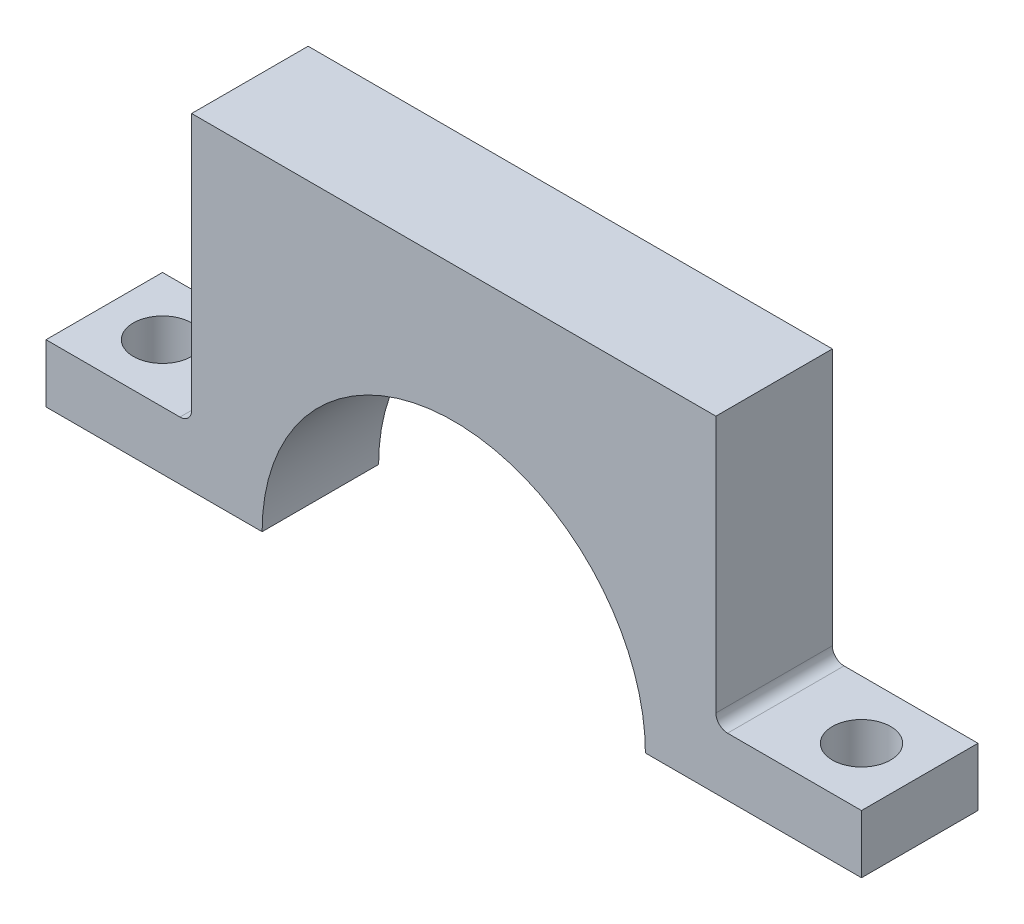
ISO-10303-21;
HEADER;
FILE_DESCRIPTION(('STEP AP214'),'2;1');
FILE_NAME('part.step','',(''),(''),'','','');
FILE_SCHEMA(('AUTOMOTIVE_DESIGN { 1 0 10303 214 1 1 1 1 }'));
ENDSEC;
DATA;
#1=APPLICATION_CONTEXT('core data for automotive mechanical design processes');
#2=APPLICATION_PROTOCOL_DEFINITION('international standard','automotive_design',2000,#1);
#3=PRODUCT_CONTEXT('',#1,'mechanical');
#4=PRODUCT('Part','Part','',(#3));
#5=PRODUCT_RELATED_PRODUCT_CATEGORY('part','',(#4));
#6=PRODUCT_DEFINITION_FORMATION('','',#4);
#7=PRODUCT_DEFINITION_CONTEXT('part definition',#1,'design');
#8=PRODUCT_DEFINITION('design','',#6,#7);
#9=PRODUCT_DEFINITION_SHAPE('','',#8);
#10=(LENGTH_UNIT() NAMED_UNIT(*) SI_UNIT(.MILLI.,.METRE.));
#11=(NAMED_UNIT(*) PLANE_ANGLE_UNIT() SI_UNIT($,.RADIAN.));
#12=(NAMED_UNIT(*) SI_UNIT($,.STERADIAN.) SOLID_ANGLE_UNIT());
#13=UNCERTAINTY_MEASURE_WITH_UNIT(LENGTH_MEASURE(1.E-05),#10,'distance_accuracy_value','');
#14=(GEOMETRIC_REPRESENTATION_CONTEXT(3) GLOBAL_UNCERTAINTY_ASSIGNED_CONTEXT((#13)) GLOBAL_UNIT_ASSIGNED_CONTEXT((#10,
#11,#12)) REPRESENTATION_CONTEXT('',''));
#15=CARTESIAN_POINT('',(0.,0.,0.));
#16=DIRECTION('',(0.,0.,1.));
#17=DIRECTION('',(1.,0.,0.));
#18=AXIS2_PLACEMENT_3D('',#15,#16,#17);
#19=CARTESIAN_POINT('',(0.,0.,5.));
#20=DIRECTION('',(0.,0.,-1.));
#21=DIRECTION('',(-1.,0.,0.));
#22=AXIS2_PLACEMENT_3D('',#19,#20,#21);
#23=CYLINDRICAL_SURFACE('',#22,16.45);
#24=CARTESIAN_POINT('',(0.,0.,-5.));
#25=DIRECTION('',(0.,0.,-1.));
#26=DIRECTION('',(1.,0.,0.));
#27=AXIS2_PLACEMENT_3D('',#24,#25,#26);
#28=CIRCLE('',#27,16.45);
#29=CARTESIAN_POINT('',(-16.45,0.,-5.));
#30=VERTEX_POINT('',#29);
#31=CARTESIAN_POINT('',(16.45,0.,-5.));
#32=VERTEX_POINT('',#31);
#33=EDGE_CURVE('E191',#30,#32,#28,.T.);
#34=ORIENTED_EDGE('',*,*,#33,.T.);
#35=DIRECTION('',(0.,0.,-1.));
#36=VECTOR('',#35,1.);
#37=CARTESIAN_POINT('',(16.45,0.,5.));
#38=LINE('',#37,#36);
#39=CARTESIAN_POINT('',(16.45,0.,5.));
#40=VERTEX_POINT('',#39);
#41=EDGE_CURVE('E244',#40,#32,#38,.T.);
#42=ORIENTED_EDGE('',*,*,#41,.F.);
#43=CARTESIAN_POINT('',(0.,0.,5.));
#44=DIRECTION('',(0.,0.,-1.));
#45=DIRECTION('',(1.,0.,0.));
#46=AXIS2_PLACEMENT_3D('',#43,#44,#45);
#47=CIRCLE('',#46,16.45);
#48=CARTESIAN_POINT('',(-16.45,0.,5.));
#49=VERTEX_POINT('',#48);
#50=EDGE_CURVE('E195',#49,#40,#47,.T.);
#51=ORIENTED_EDGE('',*,*,#50,.F.);
#52=DIRECTION('',(0.,0.,-1.));
#53=VECTOR('',#52,1.);
#54=CARTESIAN_POINT('',(-16.45,0.,5.));
#55=LINE('',#54,#53);
#56=EDGE_CURVE('E214',#49,#30,#55,.T.);
#57=ORIENTED_EDGE('',*,*,#56,.T.);
#58=EDGE_LOOP('',(#34,#42,#51,#57));
#59=FACE_BOUND('',#58,.T.);
#60=ADVANCED_FACE('F39',(#59),#23,.F.);
#61=CARTESIAN_POINT('',(16.45,0.,5.));
#62=DIRECTION('',(0.,1.,0.));
#63=DIRECTION('',(-1.,0.,0.));
#64=AXIS2_PLACEMENT_3D('',#61,#62,#63);
#65=PLANE('',#64);
#66=DIRECTION('',(1.,0.,0.));
#67=VECTOR('',#66,1.);
#68=CARTESIAN_POINT('',(16.45,0.,-5.));
#69=LINE('',#68,#67);
#70=CARTESIAN_POINT('',(35.,0.,-5.));
#71=VERTEX_POINT('',#70);
#72=EDGE_CURVE('E218',#32,#71,#69,.T.);
#73=ORIENTED_EDGE('',*,*,#72,.T.);
#74=DIRECTION('',(0.,0.,1.));
#75=VECTOR('',#74,1.);
#76=CARTESIAN_POINT('',(35.,0.,5.));
#77=LINE('',#76,#75);
#78=CARTESIAN_POINT('',(35.,0.,5.));
#79=VERTEX_POINT('',#78);
#80=EDGE_CURVE('E168',#71,#79,#77,.T.);
#81=ORIENTED_EDGE('',*,*,#80,.T.);
#82=DIRECTION('',(1.,0.,0.));
#83=VECTOR('',#82,1.);
#84=CARTESIAN_POINT('',(16.45,0.,5.));
#85=LINE('',#84,#83);
#86=EDGE_CURVE('E199',#40,#79,#85,.T.);
#87=ORIENTED_EDGE('',*,*,#86,.F.);
#88=ORIENTED_EDGE('',*,*,#41,.T.);
#89=EDGE_LOOP('',(#73,#81,#87,#88));
#90=FACE_BOUND('',#89,.T.);
#91=CARTESIAN_POINT('',(30.,0.,0.));
#92=DIRECTION('',(0.,-1.,0.));
#93=DIRECTION('',(-1.,0.,0.));
#94=AXIS2_PLACEMENT_3D('',#91,#92,#93);
#95=CIRCLE('',#94,2.5);
#96=CARTESIAN_POINT('',(27.5,0.,0.));
#97=VERTEX_POINT('',#96);
#98=EDGE_CURVE('E162',#97,#97,#95,.T.);
#99=ORIENTED_EDGE('',*,*,#98,.F.);
#100=EDGE_LOOP('',(#99));
#101=FACE_BOUND('',#100,.T.);
#102=ADVANCED_FACE('F291',(#90,#101),#65,.F.);
#103=CARTESIAN_POINT('',(22.5,0.,5.));
#104=DIRECTION('',(-1.,0.,0.));
#105=DIRECTION('',(0.,0.,1.));
#106=AXIS2_PLACEMENT_3D('',#103,#104,#105);
#107=PLANE('',#106);
#108=DIRECTION('',(0.,1.,0.));
#109=VECTOR('',#108,1.);
#110=CARTESIAN_POINT('',(22.5,0.,5.));
#111=LINE('',#110,#109);
#112=CARTESIAN_POINT('',(22.5,6.,5.));
#113=VERTEX_POINT('',#112);
#114=CARTESIAN_POINT('',(22.5,28.0667067082245,5.));
#115=VERTEX_POINT('',#114);
#116=EDGE_CURVE('E202',#113,#115,#111,.T.);
#117=ORIENTED_EDGE('',*,*,#116,.F.);
#118=DIRECTION('',(0.,0.,-1.));
#119=VECTOR('',#118,1.);
#120=CARTESIAN_POINT('',(22.5,6.,5.));
#121=LINE('',#120,#119);
#122=CARTESIAN_POINT('',(22.5,6.,-5.));
#123=VERTEX_POINT('',#122);
#124=EDGE_CURVE('E248',#113,#123,#121,.T.);
#125=ORIENTED_EDGE('',*,*,#124,.T.);
#126=DIRECTION('',(0.,1.,0.));
#127=VECTOR('',#126,1.);
#128=CARTESIAN_POINT('',(22.5,0.,-5.));
#129=LINE('',#128,#127);
#130=CARTESIAN_POINT('',(22.5,28.0667067082245,-5.));
#131=VERTEX_POINT('',#130);
#132=EDGE_CURVE('E221',#123,#131,#129,.T.);
#133=ORIENTED_EDGE('',*,*,#132,.T.);
#134=DIRECTION('',(0.,0.,-1.));
#135=VECTOR('',#134,1.);
#136=CARTESIAN_POINT('',(22.5,28.0667067082245,5.));
#137=LINE('',#136,#135);
#138=EDGE_CURVE('E240',#115,#131,#137,.T.);
#139=ORIENTED_EDGE('',*,*,#138,.F.);
#140=EDGE_LOOP('',(#117,#125,#133,#139));
#141=FACE_BOUND('',#140,.T.);
#142=ADVANCED_FACE('F276',(#141),#107,.F.);
#143=CARTESIAN_POINT('',(22.5,28.0667067082245,5.));
#144=DIRECTION('',(0.,-1.,0.));
#145=DIRECTION('',(1.,0.,0.));
#146=AXIS2_PLACEMENT_3D('',#143,#144,#145);
#147=PLANE('',#146);
#148=DIRECTION('',(-1.,0.,0.));
#149=VECTOR('',#148,1.);
#150=CARTESIAN_POINT('',(22.5,28.0667067082245,-5.));
#151=LINE('',#150,#149);
#152=CARTESIAN_POINT('',(-22.5,28.0667067082245,-5.));
#153=VERTEX_POINT('',#152);
#154=EDGE_CURVE('E224',#131,#153,#151,.T.);
#155=ORIENTED_EDGE('',*,*,#154,.T.);
#156=DIRECTION('',(0.,0.,-1.));
#157=VECTOR('',#156,1.);
#158=CARTESIAN_POINT('',(-22.5,28.0667067082245,5.));
#159=LINE('',#158,#157);
#160=CARTESIAN_POINT('',(-22.5,28.0667067082245,5.));
#161=VERTEX_POINT('',#160);
#162=EDGE_CURVE('E236',#161,#153,#159,.T.);
#163=ORIENTED_EDGE('',*,*,#162,.F.);
#164=DIRECTION('',(-1.,0.,0.));
#165=VECTOR('',#164,1.);
#166=CARTESIAN_POINT('',(22.5,28.0667067082245,5.));
#167=LINE('',#166,#165);
#168=EDGE_CURVE('E205',#115,#161,#167,.T.);
#169=ORIENTED_EDGE('',*,*,#168,.F.);
#170=ORIENTED_EDGE('',*,*,#138,.T.);
#171=EDGE_LOOP('',(#155,#163,#169,#170));
#172=FACE_BOUND('',#171,.T.);
#173=ADVANCED_FACE('F307',(#172),#147,.F.);
#174=CARTESIAN_POINT('',(-22.5,0.,5.));
#175=DIRECTION('',(1.,0.,0.));
#176=DIRECTION('',(0.,1.,0.));
#177=AXIS2_PLACEMENT_3D('',#174,#175,#176);
#178=PLANE('',#177);
#179=DIRECTION('',(0.,-1.,0.));
#180=VECTOR('',#179,1.);
#181=CARTESIAN_POINT('',(-22.5,0.,-5.));
#182=LINE('',#181,#180);
#183=CARTESIAN_POINT('',(-22.5,6.,-5.));
#184=VERTEX_POINT('',#183);
#185=EDGE_CURVE('E227',#153,#184,#182,.T.);
#186=ORIENTED_EDGE('',*,*,#185,.T.);
#187=DIRECTION('',(0.,0.,1.));
#188=VECTOR('',#187,1.);
#189=CARTESIAN_POINT('',(-22.5,6.,5.));
#190=LINE('',#189,#188);
#191=CARTESIAN_POINT('',(-22.5,6.,5.));
#192=VERTEX_POINT('',#191);
#193=EDGE_CURVE('E255',#184,#192,#190,.T.);
#194=ORIENTED_EDGE('',*,*,#193,.T.);
#195=DIRECTION('',(0.,-1.,0.));
#196=VECTOR('',#195,1.);
#197=CARTESIAN_POINT('',(-22.5,0.,5.));
#198=LINE('',#197,#196);
#199=EDGE_CURVE('E208',#161,#192,#198,.T.);
#200=ORIENTED_EDGE('',*,*,#199,.F.);
#201=ORIENTED_EDGE('',*,*,#162,.T.);
#202=EDGE_LOOP('',(#186,#194,#200,#201));
#203=FACE_BOUND('',#202,.T.);
#204=ADVANCED_FACE('F303',(#203),#178,.F.);
#205=CARTESIAN_POINT('',(-16.45,0.,5.));
#206=DIRECTION('',(0.,1.,0.));
#207=DIRECTION('',(-1.,0.,0.));
#208=AXIS2_PLACEMENT_3D('',#205,#206,#207);
#209=PLANE('',#208);
#210=DIRECTION('',(1.,0.,0.));
#211=VECTOR('',#210,1.);
#212=CARTESIAN_POINT('',(-16.45,0.,-5.));
#213=LINE('',#212,#211);
#214=CARTESIAN_POINT('',(-35.,0.,-5.));
#215=VERTEX_POINT('',#214);
#216=EDGE_CURVE('E132',#215,#30,#213,.T.);
#217=ORIENTED_EDGE('',*,*,#216,.T.);
#218=ORIENTED_EDGE('',*,*,#56,.F.);
#219=DIRECTION('',(1.,0.,0.));
#220=VECTOR('',#219,1.);
#221=CARTESIAN_POINT('',(-16.45,0.,5.));
#222=LINE('',#221,#220);
#223=CARTESIAN_POINT('',(-35.,0.,5.));
#224=VERTEX_POINT('',#223);
#225=EDGE_CURVE('E211',#224,#49,#222,.T.);
#226=ORIENTED_EDGE('',*,*,#225,.F.);
#227=DIRECTION('',(0.,0.,-1.));
#228=VECTOR('',#227,1.);
#229=CARTESIAN_POINT('',(-35.,0.,5.));
#230=LINE('',#229,#228);
#231=EDGE_CURVE('E150',#224,#215,#230,.T.);
#232=ORIENTED_EDGE('',*,*,#231,.T.);
#233=EDGE_LOOP('',(#217,#218,#226,#232));
#234=FACE_BOUND('',#233,.T.);
#235=CARTESIAN_POINT('',(-30.,0.,0.));
#236=DIRECTION('',(0.,-1.,0.));
#237=DIRECTION('',(1.,0.,0.));
#238=AXIS2_PLACEMENT_3D('',#235,#236,#237);
#239=CIRCLE('',#238,2.5);
#240=CARTESIAN_POINT('',(-27.5,0.,0.));
#241=VERTEX_POINT('',#240);
#242=EDGE_CURVE('E156',#241,#241,#239,.T.);
#243=ORIENTED_EDGE('',*,*,#242,.F.);
#244=EDGE_LOOP('',(#243));
#245=FACE_BOUND('',#244,.T.);
#246=ADVANCED_FACE('F297',(#234,#245),#209,.F.);
#247=CARTESIAN_POINT('',(0.,0.,5.));
#248=DIRECTION('',(0.,0.,1.));
#249=DIRECTION('',(1.,0.,0.));
#250=AXIS2_PLACEMENT_3D('',#247,#248,#249);
#251=PLANE('',#250);
#252=ORIENTED_EDGE('',*,*,#50,.T.);
#253=ORIENTED_EDGE('',*,*,#86,.T.);
#254=DIRECTION('',(0.,-1.,0.));
#255=VECTOR('',#254,1.);
#256=CARTESIAN_POINT('',(35.,5.,5.));
#257=LINE('',#256,#255);
#258=CARTESIAN_POINT('',(35.,5.,5.));
#259=VERTEX_POINT('',#258);
#260=EDGE_CURVE('E187',#259,#79,#257,.T.);
#261=ORIENTED_EDGE('',*,*,#260,.F.);
#262=DIRECTION('',(-1.,0.,0.));
#263=VECTOR('',#262,1.);
#264=CARTESIAN_POINT('',(22.5,5.,5.));
#265=LINE('',#264,#263);
#266=CARTESIAN_POINT('',(23.5,5.,5.));
#267=VERTEX_POINT('',#266);
#268=EDGE_CURVE('E179',#259,#267,#265,.T.);
#269=ORIENTED_EDGE('',*,*,#268,.T.);
#270=CARTESIAN_POINT('',(23.5,6.,5.));
#271=DIRECTION('',(0.,0.,1.));
#272=DIRECTION('',(1.,0.,0.));
#273=AXIS2_PLACEMENT_3D('',#270,#271,#272);
#274=CIRCLE('',#273,1.);
#275=EDGE_CURVE('E264',#267,#113,#274,.F.);
#276=ORIENTED_EDGE('',*,*,#275,.T.);
#277=ORIENTED_EDGE('',*,*,#116,.T.);
#278=ORIENTED_EDGE('',*,*,#168,.T.);
#279=ORIENTED_EDGE('',*,*,#199,.T.);
#280=CARTESIAN_POINT('',(-23.5,6.,5.));
#281=DIRECTION('',(0.,0.,1.));
#282=DIRECTION('',(1.,0.,0.));
#283=AXIS2_PLACEMENT_3D('',#280,#281,#282);
#284=CIRCLE('',#283,1.);
#285=CARTESIAN_POINT('',(-23.5,5.,5.));
#286=VERTEX_POINT('',#285);
#287=EDGE_CURVE('E48',#192,#286,#284,.F.);
#288=ORIENTED_EDGE('',*,*,#287,.T.);
#289=DIRECTION('',(-1.,0.,0.));
#290=VECTOR('',#289,1.);
#291=CARTESIAN_POINT('',(-35.,5.,5.));
#292=LINE('',#291,#290);
#293=CARTESIAN_POINT('',(-35.,5.,5.));
#294=VERTEX_POINT('',#293);
#295=EDGE_CURVE('E139',#286,#294,#292,.T.);
#296=ORIENTED_EDGE('',*,*,#295,.T.);
#297=DIRECTION('',(0.,-1.,0.));
#298=VECTOR('',#297,1.);
#299=CARTESIAN_POINT('',(-35.,5.,5.));
#300=LINE('',#299,#298);
#301=EDGE_CURVE('E138',#294,#224,#300,.T.);
#302=ORIENTED_EDGE('',*,*,#301,.T.);
#303=ORIENTED_EDGE('',*,*,#225,.T.);
#304=EDGE_LOOP('',(#252,#253,#261,#269,#276,#277,#278,#279,#288,#296,#302,#303));
#305=FACE_BOUND('',#304,.T.);
#306=ADVANCED_FACE('F269',(#305),#251,.T.);
#307=CARTESIAN_POINT('',(0.,0.,-5.));
#308=DIRECTION('',(0.,0.,1.));
#309=DIRECTION('',(1.,0.,0.));
#310=AXIS2_PLACEMENT_3D('',#307,#308,#309);
#311=PLANE('',#310);
#312=ORIENTED_EDGE('',*,*,#33,.F.);
#313=ORIENTED_EDGE('',*,*,#216,.F.);
#314=DIRECTION('',(0.,-1.,0.));
#315=VECTOR('',#314,1.);
#316=CARTESIAN_POINT('',(-35.,5.,-5.));
#317=LINE('',#316,#315);
#318=CARTESIAN_POINT('',(-35.,5.,-5.));
#319=VERTEX_POINT('',#318);
#320=EDGE_CURVE('E127',#319,#215,#317,.T.);
#321=ORIENTED_EDGE('',*,*,#320,.F.);
#322=DIRECTION('',(1.,0.,0.));
#323=VECTOR('',#322,1.);
#324=CARTESIAN_POINT('',(-35.,5.,-5.));
#325=LINE('',#324,#323);
#326=CARTESIAN_POINT('',(-23.5,5.,-5.));
#327=VERTEX_POINT('',#326);
#328=EDGE_CURVE('E130',#319,#327,#325,.T.);
#329=ORIENTED_EDGE('',*,*,#328,.T.);
#330=CARTESIAN_POINT('',(-23.5,6.,-5.));
#331=DIRECTION('',(0.,0.,1.));
#332=DIRECTION('',(1.,0.,0.));
#333=AXIS2_PLACEMENT_3D('',#330,#331,#332);
#334=CIRCLE('',#333,1.);
#335=EDGE_CURVE('E11',#327,#184,#334,.T.);
#336=ORIENTED_EDGE('',*,*,#335,.T.);
#337=ORIENTED_EDGE('',*,*,#185,.F.);
#338=ORIENTED_EDGE('',*,*,#154,.F.);
#339=ORIENTED_EDGE('',*,*,#132,.F.);
#340=CARTESIAN_POINT('',(23.5,6.,-5.));
#341=DIRECTION('',(0.,0.,1.));
#342=DIRECTION('',(1.,0.,0.));
#343=AXIS2_PLACEMENT_3D('',#340,#341,#342);
#344=CIRCLE('',#343,1.);
#345=CARTESIAN_POINT('',(23.5,5.,-5.));
#346=VERTEX_POINT('',#345);
#347=EDGE_CURVE('E261',#123,#346,#344,.T.);
#348=ORIENTED_EDGE('',*,*,#347,.T.);
#349=DIRECTION('',(1.,0.,0.));
#350=VECTOR('',#349,1.);
#351=CARTESIAN_POINT('',(22.5,5.,-5.));
#352=LINE('',#351,#350);
#353=CARTESIAN_POINT('',(35.,5.,-5.));
#354=VERTEX_POINT('',#353);
#355=EDGE_CURVE('E172',#346,#354,#352,.T.);
#356=ORIENTED_EDGE('',*,*,#355,.T.);
#357=DIRECTION('',(0.,-1.,0.));
#358=VECTOR('',#357,1.);
#359=CARTESIAN_POINT('',(35.,5.,-5.));
#360=LINE('',#359,#358);
#361=EDGE_CURVE('E183',#354,#71,#360,.T.);
#362=ORIENTED_EDGE('',*,*,#361,.T.);
#363=ORIENTED_EDGE('',*,*,#72,.F.);
#364=EDGE_LOOP('',(#312,#313,#321,#329,#336,#337,#338,#339,#348,#356,#362,#363));
#365=FACE_BOUND('',#364,.T.);
#366=ADVANCED_FACE('F129',(#365),#311,.F.);
#367=CARTESIAN_POINT('',(35.,5.,5.));
#368=DIRECTION('',(1.,0.,0.));
#369=DIRECTION('',(0.,1.,0.));
#370=AXIS2_PLACEMENT_3D('',#367,#368,#369);
#371=PLANE('',#370);
#372=ORIENTED_EDGE('',*,*,#80,.F.);
#373=ORIENTED_EDGE('',*,*,#361,.F.);
#374=DIRECTION('',(0.,0.,1.));
#375=VECTOR('',#374,1.);
#376=CARTESIAN_POINT('',(35.,5.,5.));
#377=LINE('',#376,#375);
#378=EDGE_CURVE('E175',#354,#259,#377,.T.);
#379=ORIENTED_EDGE('',*,*,#378,.T.);
#380=ORIENTED_EDGE('',*,*,#260,.T.);
#381=EDGE_LOOP('',(#372,#373,#379,#380));
#382=FACE_BOUND('',#381,.T.);
#383=ADVANCED_FACE('F288',(#382),#371,.T.);
#384=CARTESIAN_POINT('',(0.,5.,0.));
#385=DIRECTION('',(0.,1.,0.));
#386=DIRECTION('',(-1.,0.,0.));
#387=AXIS2_PLACEMENT_3D('',#384,#385,#386);
#388=PLANE('',#387);
#389=CARTESIAN_POINT('',(30.,5.,0.));
#390=DIRECTION('',(0.,-1.,0.));
#391=DIRECTION('',(-1.,0.,0.));
#392=AXIS2_PLACEMENT_3D('',#389,#390,#391);
#393=CIRCLE('',#392,2.5);
#394=CARTESIAN_POINT('',(27.5,5.,0.));
#395=VERTEX_POINT('',#394);
#396=EDGE_CURVE('E164',#395,#395,#393,.T.);
#397=ORIENTED_EDGE('',*,*,#396,.T.);
#398=EDGE_LOOP('',(#397));
#399=FACE_BOUND('',#398,.T.);
#400=ORIENTED_EDGE('',*,*,#355,.F.);
#401=DIRECTION('',(0.,0.,-1.));
#402=VECTOR('',#401,1.);
#403=CARTESIAN_POINT('',(23.5,5.,0.));
#404=LINE('',#403,#402);
#405=EDGE_CURVE('E252',#346,#267,#404,.F.);
#406=ORIENTED_EDGE('',*,*,#405,.T.);
#407=ORIENTED_EDGE('',*,*,#268,.F.);
#408=ORIENTED_EDGE('',*,*,#378,.F.);
#409=EDGE_LOOP('',(#400,#406,#407,#408));
#410=FACE_BOUND('',#409,.T.);
#411=ADVANCED_FACE('F285',(#399,#410),#388,.T.);
#412=CARTESIAN_POINT('',(30.,5.,0.));
#413=DIRECTION('',(0.,-1.,0.));
#414=DIRECTION('',(1.,0.,0.));
#415=AXIS2_PLACEMENT_3D('',#412,#413,#414);
#416=CYLINDRICAL_SURFACE('',#415,2.5);
#417=ORIENTED_EDGE('',*,*,#396,.F.);
#418=EDGE_LOOP('',(#417));
#419=FACE_BOUND('',#418,.T.);
#420=ORIENTED_EDGE('',*,*,#98,.T.);
#421=EDGE_LOOP('',(#420));
#422=FACE_BOUND('',#421,.T.);
#423=ADVANCED_FACE('F340',(#419,#422),#416,.F.);
#424=CARTESIAN_POINT('',(-35.,5.,5.));
#425=DIRECTION('',(-1.,0.,0.));
#426=DIRECTION('',(0.,-1.,0.));
#427=AXIS2_PLACEMENT_3D('',#424,#425,#426);
#428=PLANE('',#427);
#429=ORIENTED_EDGE('',*,*,#231,.F.);
#430=ORIENTED_EDGE('',*,*,#301,.F.);
#431=DIRECTION('',(0.,0.,-1.));
#432=VECTOR('',#431,1.);
#433=CARTESIAN_POINT('',(-35.,5.,5.));
#434=LINE('',#433,#432);
#435=EDGE_CURVE('E143',#294,#319,#434,.T.);
#436=ORIENTED_EDGE('',*,*,#435,.T.);
#437=ORIENTED_EDGE('',*,*,#320,.T.);
#438=EDGE_LOOP('',(#429,#430,#436,#437));
#439=FACE_BOUND('',#438,.T.);
#440=ADVANCED_FACE('F147',(#439),#428,.T.);
#441=CARTESIAN_POINT('',(0.,5.,0.));
#442=DIRECTION('',(0.,-1.,0.));
#443=DIRECTION('',(1.,0.,0.));
#444=AXIS2_PLACEMENT_3D('',#441,#442,#443);
#445=PLANE('',#444);
#446=CARTESIAN_POINT('',(-30.,5.,0.));
#447=DIRECTION('',(0.,-1.,0.));
#448=DIRECTION('',(1.,0.,0.));
#449=AXIS2_PLACEMENT_3D('',#446,#447,#448);
#450=CIRCLE('',#449,2.5);
#451=CARTESIAN_POINT('',(-27.5,5.,0.));
#452=VERTEX_POINT('',#451);
#453=EDGE_CURVE('E153',#452,#452,#450,.T.);
#454=ORIENTED_EDGE('',*,*,#453,.T.);
#455=EDGE_LOOP('',(#454));
#456=FACE_BOUND('',#455,.T.);
#457=ORIENTED_EDGE('',*,*,#295,.F.);
#458=DIRECTION('',(0.,0.,1.));
#459=VECTOR('',#458,1.);
#460=CARTESIAN_POINT('',(-23.5,5.,-5.));
#461=LINE('',#460,#459);
#462=EDGE_CURVE('E55',#286,#327,#461,.F.);
#463=ORIENTED_EDGE('',*,*,#462,.T.);
#464=ORIENTED_EDGE('',*,*,#328,.F.);
#465=ORIENTED_EDGE('',*,*,#435,.F.);
#466=EDGE_LOOP('',(#457,#463,#464,#465));
#467=FACE_BOUND('',#466,.T.);
#468=ADVANCED_FACE('F142',(#456,#467),#445,.F.);
#469=CARTESIAN_POINT('',(-30.,5.,0.));
#470=DIRECTION('',(0.,-1.,0.));
#471=DIRECTION('',(1.,0.,0.));
#472=AXIS2_PLACEMENT_3D('',#469,#470,#471);
#473=CYLINDRICAL_SURFACE('',#472,2.5);
#474=ORIENTED_EDGE('',*,*,#453,.F.);
#475=EDGE_LOOP('',(#474));
#476=FACE_BOUND('',#475,.T.);
#477=ORIENTED_EDGE('',*,*,#242,.T.);
#478=EDGE_LOOP('',(#477));
#479=FACE_BOUND('',#478,.T.);
#480=ADVANCED_FACE('F323',(#476,#479),#473,.F.);
#481=CARTESIAN_POINT('',(23.5,6.,5.));
#482=DIRECTION('',(0.,0.,-1.));
#483=DIRECTION('',(-1.,0.,0.));
#484=AXIS2_PLACEMENT_3D('',#481,#482,#483);
#485=CYLINDRICAL_SURFACE('',#484,1.);
#486=ORIENTED_EDGE('',*,*,#275,.F.);
#487=ORIENTED_EDGE('',*,*,#405,.F.);
#488=ORIENTED_EDGE('',*,*,#347,.F.);
#489=ORIENTED_EDGE('',*,*,#124,.F.);
#490=EDGE_LOOP('',(#486,#487,#488,#489));
#491=FACE_BOUND('',#490,.T.);
#492=ADVANCED_FACE('F279',(#491),#485,.F.);
#493=CARTESIAN_POINT('',(-23.5,6.,5.));
#494=DIRECTION('',(0.,0.,-1.));
#495=DIRECTION('',(-1.,0.,0.));
#496=AXIS2_PLACEMENT_3D('',#493,#494,#495);
#497=CYLINDRICAL_SURFACE('',#496,1.);
#498=ORIENTED_EDGE('',*,*,#335,.F.);
#499=ORIENTED_EDGE('',*,*,#462,.F.);
#500=ORIENTED_EDGE('',*,*,#287,.F.);
#501=ORIENTED_EDGE('',*,*,#193,.F.);
#502=EDGE_LOOP('',(#498,#499,#500,#501));
#503=FACE_BOUND('',#502,.T.);
#504=ADVANCED_FACE('F41',(#503),#497,.F.);
#505=CLOSED_SHELL('',(#60,#102,#142,#173,#204,#246,#306,#366,#383,#411,#423,#440,#468,#480,#492,#504));
#506=MANIFOLD_SOLID_BREP('B2',#505);
#507=ADVANCED_BREP_SHAPE_REPRESENTATION('',(#18,#506),#14);
#508=SHAPE_DEFINITION_REPRESENTATION(#9,#507);
ENDSEC;
END-ISO-10303-21;
